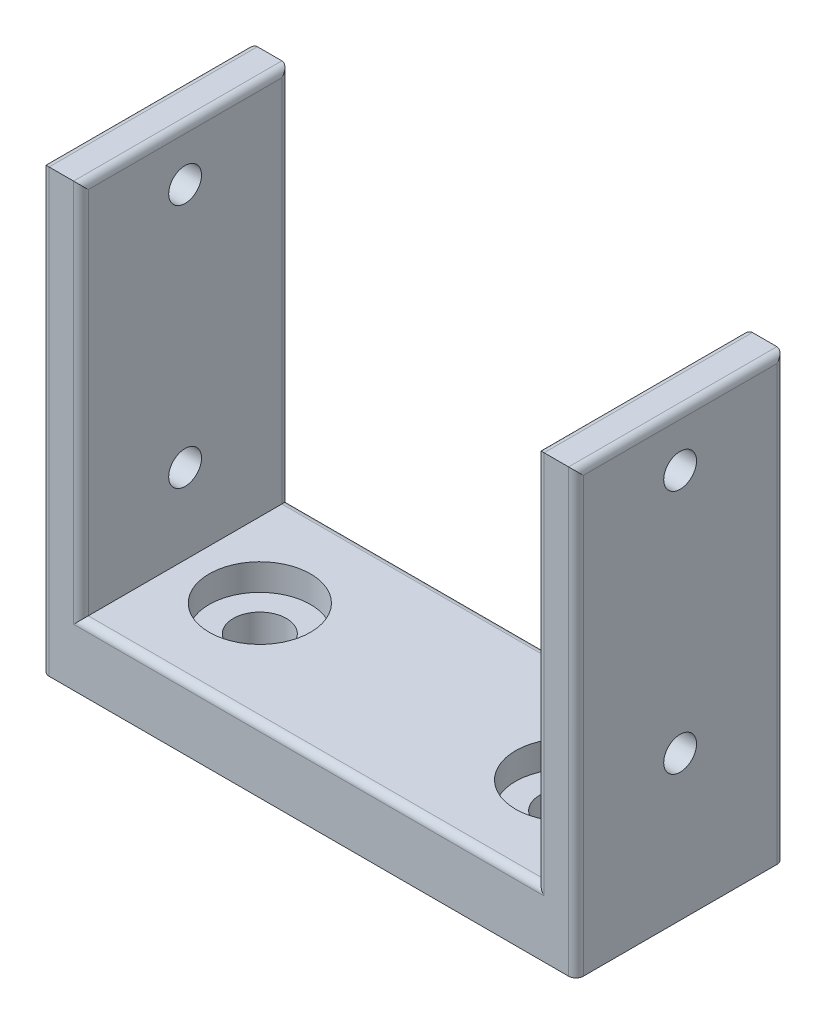
ISO-10303-21;
HEADER;
FILE_DESCRIPTION(('STEP AP214'),'2;1');
FILE_NAME('part.step','',(''),(''),'','','');
FILE_SCHEMA(('AUTOMOTIVE_DESIGN { 1 0 10303 214 1 1 1 1 }'));
ENDSEC;
DATA;
#1=APPLICATION_CONTEXT('core data for automotive mechanical design processes');
#2=APPLICATION_PROTOCOL_DEFINITION('international standard','automotive_design',2000,#1);
#3=PRODUCT_CONTEXT('',#1,'mechanical');
#4=PRODUCT('Part','Part','',(#3));
#5=PRODUCT_RELATED_PRODUCT_CATEGORY('part','',(#4));
#6=PRODUCT_DEFINITION_FORMATION('','',#4);
#7=PRODUCT_DEFINITION_CONTEXT('part definition',#1,'design');
#8=PRODUCT_DEFINITION('design','',#6,#7);
#9=PRODUCT_DEFINITION_SHAPE('','',#8);
#10=(LENGTH_UNIT() NAMED_UNIT(*) SI_UNIT(.MILLI.,.METRE.));
#11=(NAMED_UNIT(*) PLANE_ANGLE_UNIT() SI_UNIT($,.RADIAN.));
#12=(NAMED_UNIT(*) SI_UNIT($,.STERADIAN.) SOLID_ANGLE_UNIT());
#13=UNCERTAINTY_MEASURE_WITH_UNIT(LENGTH_MEASURE(1.E-05),#10,'distance_accuracy_value','');
#14=(GEOMETRIC_REPRESENTATION_CONTEXT(3) GLOBAL_UNCERTAINTY_ASSIGNED_CONTEXT((#13)) GLOBAL_UNIT_ASSIGNED_CONTEXT((#10,
#11,#12)) REPRESENTATION_CONTEXT('',''));
#15=CARTESIAN_POINT('',(0.,0.,0.));
#16=DIRECTION('',(0.,0.,1.));
#17=DIRECTION('',(1.,0.,0.));
#18=AXIS2_PLACEMENT_3D('',#15,#16,#17);
#19=CARTESIAN_POINT('',(0.,4.1599866,0.));
#20=DIRECTION('',(0.,1.,0.));
#21=DIRECTION('',(0.,0.,1.));
#22=AXIS2_PLACEMENT_3D('',#19,#20,#21);
#23=PLANE('',#22);
#24=CARTESIAN_POINT('',(11.811,4.1599866,-10.795));
#25=DIRECTION('',(0.,1.,0.));
#26=DIRECTION('',(0.,0.,1.));
#27=AXIS2_PLACEMENT_3D('',#24,#25,#26);
#28=CIRCLE('',#27,5.24999999999999);
#29=CARTESIAN_POINT('',(11.811,4.1599866,-5.54500000000001));
#30=VERTEX_POINT('',#29);
#31=EDGE_CURVE('E362',#30,#30,#28,.T.);
#32=ORIENTED_EDGE('',*,*,#31,.F.);
#33=EDGE_LOOP('',(#32));
#34=FACE_BOUND('',#33,.T.);
#35=CARTESIAN_POINT('',(43.561,4.1599866,-10.795));
#36=DIRECTION('',(0.,1.,0.));
#37=DIRECTION('',(0.,0.,1.));
#38=AXIS2_PLACEMENT_3D('',#35,#36,#37);
#39=CIRCLE('',#38,5.24999999999999);
#40=CARTESIAN_POINT('',(43.561,4.1599866,-5.54500000000001));
#41=VERTEX_POINT('',#40);
#42=EDGE_CURVE('E400',#41,#41,#39,.T.);
#43=ORIENTED_EDGE('',*,*,#42,.F.);
#44=EDGE_LOOP('',(#43));
#45=FACE_BOUND('',#44,.T.);
#46=DIRECTION('',(0.,0.,1.));
#47=VECTOR('',#46,1.);
#48=CARTESIAN_POINT('',(51.308,4.1599866,-21.59));
#49=LINE('',#48,#47);
#50=CARTESIAN_POINT('',(51.308,4.1599866,-20.828));
#51=VERTEX_POINT('',#50);
#52=CARTESIAN_POINT('',(51.308,4.1599866,-0.761999999999999));
#53=VERTEX_POINT('',#52);
#54=EDGE_CURVE('E222',#51,#53,#49,.T.);
#55=ORIENTED_EDGE('',*,*,#54,.F.);
#56=DIRECTION('',(-1.,0.,0.));
#57=VECTOR('',#56,1.);
#58=CARTESIAN_POINT('',(4.064,4.1599866,-20.828));
#59=LINE('',#58,#57);
#60=CARTESIAN_POINT('',(4.064,4.1599866,-20.828));
#61=VERTEX_POINT('',#60);
#62=EDGE_CURVE('E273',#51,#61,#59,.T.);
#63=ORIENTED_EDGE('',*,*,#62,.T.);
#64=DIRECTION('',(0.,0.,-1.));
#65=VECTOR('',#64,1.);
#66=CARTESIAN_POINT('',(4.064,4.1599866,-21.59));
#67=LINE('',#66,#65);
#68=CARTESIAN_POINT('',(4.064,4.1599866,-0.761999999999999));
#69=VERTEX_POINT('',#68);
#70=EDGE_CURVE('E226',#69,#61,#67,.T.);
#71=ORIENTED_EDGE('',*,*,#70,.F.);
#72=DIRECTION('',(1.,0.,0.));
#73=VECTOR('',#72,1.);
#74=CARTESIAN_POINT('',(51.308,4.1599866,-0.762));
#75=LINE('',#74,#73);
#76=EDGE_CURVE('E270',#69,#53,#75,.T.);
#77=ORIENTED_EDGE('',*,*,#76,.T.);
#78=EDGE_LOOP('',(#55,#63,#71,#77));
#79=FACE_BOUND('',#78,.T.);
#80=ADVANCED_FACE('F42',(#34,#45,#79),#23,.T.);
#81=CARTESIAN_POINT('',(0.,4.1599866,-21.59));
#82=DIRECTION('',(1.,0.,0.));
#83=DIRECTION('',(0.,0.,-1.));
#84=AXIS2_PLACEMENT_3D('',#81,#82,#83);
#85=PLANE('',#84);
#86=CARTESIAN_POINT('',(0.,37.8599954,-10.795));
#87=DIRECTION('',(-1.,0.,0.));
#88=DIRECTION('',(0.,0.,1.));
#89=AXIS2_PLACEMENT_3D('',#86,#87,#88);
#90=CIRCLE('',#89,1.69999999999999);
#91=CARTESIAN_POINT('',(0.,37.8599954,-9.09500000000001));
#92=VERTEX_POINT('',#91);
#93=EDGE_CURVE('E188',#92,#92,#90,.T.);
#94=ORIENTED_EDGE('',*,*,#93,.F.);
#95=EDGE_LOOP('',(#94));
#96=FACE_BOUND('',#95,.T.);
#97=CARTESIAN_POINT('',(0.,12.4599954,-10.795));
#98=DIRECTION('',(-1.,0.,0.));
#99=DIRECTION('',(0.,0.,1.));
#100=AXIS2_PLACEMENT_3D('',#97,#98,#99);
#101=CIRCLE('',#100,1.69999999999999);
#102=CARTESIAN_POINT('',(0.,12.4599954,-9.09500000000001));
#103=VERTEX_POINT('',#102);
#104=EDGE_CURVE('E208',#103,#103,#101,.T.);
#105=ORIENTED_EDGE('',*,*,#104,.F.);
#106=EDGE_LOOP('',(#105));
#107=FACE_BOUND('',#106,.T.);
#108=DIRECTION('',(0.,0.,1.));
#109=VECTOR('',#108,1.);
#110=CARTESIAN_POINT('',(0.,42.418,-21.59));
#111=LINE('',#110,#109);
#112=CARTESIAN_POINT('',(0.,42.418,-0.762));
#113=VERTEX_POINT('',#112);
#114=CARTESIAN_POINT('',(0.,42.418,-20.828));
#115=VERTEX_POINT('',#114);
#116=EDGE_CURVE('E52',#113,#115,#111,.F.);
#117=ORIENTED_EDGE('',*,*,#116,.T.);
#118=DIRECTION('',(0.,-1.,0.));
#119=VECTOR('',#118,1.);
#120=CARTESIAN_POINT('',(0.,4.1599866,-20.828));
#121=LINE('',#120,#119);
#122=CARTESIAN_POINT('',(0.,-2.54,-20.828));
#123=VERTEX_POINT('',#122);
#124=EDGE_CURVE('E11',#115,#123,#121,.T.);
#125=ORIENTED_EDGE('',*,*,#124,.T.);
#126=DIRECTION('',(0.,0.,1.));
#127=VECTOR('',#126,1.);
#128=CARTESIAN_POINT('',(0.,-2.54,-21.59));
#129=LINE('',#128,#127);
#130=CARTESIAN_POINT('',(0.,-2.54,-0.761999999999999));
#131=VERTEX_POINT('',#130);
#132=EDGE_CURVE('E380',#123,#131,#129,.T.);
#133=ORIENTED_EDGE('',*,*,#132,.T.);
#134=DIRECTION('',(0.,-1.,0.));
#135=VECTOR('',#134,1.);
#136=CARTESIAN_POINT('',(0.,4.1599866,-0.761999999999999));
#137=LINE('',#136,#135);
#138=EDGE_CURVE('E63',#131,#113,#137,.F.);
#139=ORIENTED_EDGE('',*,*,#138,.T.);
#140=EDGE_LOOP('',(#117,#125,#133,#139));
#141=FACE_BOUND('',#140,.T.);
#142=ADVANCED_FACE('F379',(#96,#107,#141),#85,.F.);
#143=CARTESIAN_POINT('',(0.,4.1599866,0.));
#144=DIRECTION('',(0.,0.,-1.));
#145=DIRECTION('',(-1.,0.,0.));
#146=AXIS2_PLACEMENT_3D('',#143,#144,#145);
#147=PLANE('',#146);
#148=DIRECTION('',(1.,0.,0.));
#149=VECTOR('',#148,1.);
#150=CARTESIAN_POINT('',(0.,-2.54,0.));
#151=LINE('',#150,#149);
#152=CARTESIAN_POINT('',(0.762,-2.54,0.));
#153=VERTEX_POINT('',#152);
#154=CARTESIAN_POINT('',(54.61,-2.54,0.));
#155=VERTEX_POINT('',#154);
#156=EDGE_CURVE('E196',#153,#155,#151,.T.);
#157=ORIENTED_EDGE('',*,*,#156,.T.);
#158=DIRECTION('',(0.,-1.,0.));
#159=VECTOR('',#158,1.);
#160=CARTESIAN_POINT('',(54.61,4.1599866,0.));
#161=LINE('',#160,#159);
#162=CARTESIAN_POINT('',(54.61,43.18,0.));
#163=VERTEX_POINT('',#162);
#164=EDGE_CURVE('E317',#155,#163,#161,.F.);
#165=ORIENTED_EDGE('',*,*,#164,.T.);
#166=DIRECTION('',(1.,0.,0.));
#167=VECTOR('',#166,1.);
#168=CARTESIAN_POINT('',(55.372,43.18,0.));
#169=LINE('',#168,#167);
#170=CARTESIAN_POINT('',(52.07,43.18,0.));
#171=VERTEX_POINT('',#170);
#172=EDGE_CURVE('E221',#171,#163,#169,.T.);
#173=ORIENTED_EDGE('',*,*,#172,.F.);
#174=DIRECTION('',(0.,-1.,0.));
#175=VECTOR('',#174,1.);
#176=CARTESIAN_POINT('',(52.07,4.1599866,0.));
#177=LINE('',#176,#175);
#178=CARTESIAN_POINT('',(52.07,3.3979866,0.));
#179=VERTEX_POINT('',#178);
#180=EDGE_CURVE('E311',#171,#179,#177,.T.);
#181=ORIENTED_EDGE('',*,*,#180,.T.);
#182=DIRECTION('',(1.,0.,0.));
#183=VECTOR('',#182,1.);
#184=CARTESIAN_POINT('',(4.064,3.3979866,0.));
#185=LINE('',#184,#183);
#186=CARTESIAN_POINT('',(3.302,3.3979866,0.));
#187=VERTEX_POINT('',#186);
#188=EDGE_CURVE('E308',#179,#187,#185,.F.);
#189=ORIENTED_EDGE('',*,*,#188,.T.);
#190=DIRECTION('',(0.,-1.,0.));
#191=VECTOR('',#190,1.);
#192=CARTESIAN_POINT('',(3.302,4.1599866,0.));
#193=LINE('',#192,#191);
#194=CARTESIAN_POINT('',(3.302,43.18,0.));
#195=VERTEX_POINT('',#194);
#196=EDGE_CURVE('E305',#187,#195,#193,.F.);
#197=ORIENTED_EDGE('',*,*,#196,.T.);
#198=DIRECTION('',(1.,0.,0.));
#199=VECTOR('',#198,1.);
#200=CARTESIAN_POINT('',(0.,43.18,0.));
#201=LINE('',#200,#199);
#202=CARTESIAN_POINT('',(0.762,43.18,0.));
#203=VERTEX_POINT('',#202);
#204=EDGE_CURVE('E232',#203,#195,#201,.T.);
#205=ORIENTED_EDGE('',*,*,#204,.F.);
#206=DIRECTION('',(0.,-1.,0.));
#207=VECTOR('',#206,1.);
#208=CARTESIAN_POINT('',(0.762,4.1599866,0.));
#209=LINE('',#208,#207);
#210=EDGE_CURVE('E314',#203,#153,#209,.T.);
#211=ORIENTED_EDGE('',*,*,#210,.T.);
#212=EDGE_LOOP('',(#157,#165,#173,#181,#189,#197,#205,#211));
#213=FACE_BOUND('',#212,.T.);
#214=ADVANCED_FACE('F463',(#213),#147,.F.);
#215=CARTESIAN_POINT('',(55.372,4.1599866,-21.59));
#216=DIRECTION('',(-1.,0.,0.));
#217=DIRECTION('',(0.,0.,1.));
#218=AXIS2_PLACEMENT_3D('',#215,#216,#217);
#219=PLANE('',#218);
#220=CARTESIAN_POINT('',(55.372,37.8599954,-10.795));
#221=DIRECTION('',(-1.,0.,0.));
#222=DIRECTION('',(0.,0.,1.));
#223=AXIS2_PLACEMENT_3D('',#220,#221,#222);
#224=CIRCLE('',#223,1.69999999999999);
#225=CARTESIAN_POINT('',(55.372,37.8599954,-9.09500000000001));
#226=VERTEX_POINT('',#225);
#227=EDGE_CURVE('E194',#226,#226,#224,.T.);
#228=ORIENTED_EDGE('',*,*,#227,.T.);
#229=EDGE_LOOP('',(#228));
#230=FACE_BOUND('',#229,.T.);
#231=CARTESIAN_POINT('',(55.372,12.4599954,-10.795));
#232=DIRECTION('',(-1.,0.,0.));
#233=DIRECTION('',(0.,0.,1.));
#234=AXIS2_PLACEMENT_3D('',#231,#232,#233);
#235=CIRCLE('',#234,1.69999999999999);
#236=CARTESIAN_POINT('',(55.372,12.4599954,-9.09500000000001));
#237=VERTEX_POINT('',#236);
#238=EDGE_CURVE('E212',#237,#237,#235,.T.);
#239=ORIENTED_EDGE('',*,*,#238,.T.);
#240=EDGE_LOOP('',(#239));
#241=FACE_BOUND('',#240,.T.);
#242=DIRECTION('',(0.,0.,-1.));
#243=VECTOR('',#242,1.);
#244=CARTESIAN_POINT('',(55.372,-2.54,-21.59));
#245=LINE('',#244,#243);
#246=CARTESIAN_POINT('',(55.372,-2.54,-0.761999999999999));
#247=VERTEX_POINT('',#246);
#248=CARTESIAN_POINT('',(55.372,-2.54,-20.828));
#249=VERTEX_POINT('',#248);
#250=EDGE_CURVE('E189',#247,#249,#245,.T.);
#251=ORIENTED_EDGE('',*,*,#250,.T.);
#252=DIRECTION('',(0.,-1.,0.));
#253=VECTOR('',#252,1.);
#254=CARTESIAN_POINT('',(55.372,4.1599866,-20.828));
#255=LINE('',#254,#253);
#256=CARTESIAN_POINT('',(55.372,42.418,-20.828));
#257=VERTEX_POINT('',#256);
#258=EDGE_CURVE('E160',#249,#257,#255,.F.);
#259=ORIENTED_EDGE('',*,*,#258,.T.);
#260=DIRECTION('',(0.,0.,-1.));
#261=VECTOR('',#260,1.);
#262=CARTESIAN_POINT('',(55.372,42.418,-21.59));
#263=LINE('',#262,#261);
#264=CARTESIAN_POINT('',(55.372,42.418,-0.761999999999999));
#265=VERTEX_POINT('',#264);
#266=EDGE_CURVE('E294',#257,#265,#263,.F.);
#267=ORIENTED_EDGE('',*,*,#266,.T.);
#268=DIRECTION('',(0.,-1.,0.));
#269=VECTOR('',#268,1.);
#270=CARTESIAN_POINT('',(55.372,4.1599866,-0.761999999999999));
#271=LINE('',#270,#269);
#272=EDGE_CURVE('E166',#265,#247,#271,.T.);
#273=ORIENTED_EDGE('',*,*,#272,.T.);
#274=EDGE_LOOP('',(#251,#259,#267,#273));
#275=FACE_BOUND('',#274,.T.);
#276=ADVANCED_FACE('F541',(#230,#241,#275),#219,.F.);
#277=CARTESIAN_POINT('',(0.,4.1599866,-21.59));
#278=DIRECTION('',(0.,0.,1.));
#279=DIRECTION('',(1.,0.,0.));
#280=AXIS2_PLACEMENT_3D('',#277,#278,#279);
#281=PLANE('',#280);
#282=DIRECTION('',(-1.,0.,0.));
#283=VECTOR('',#282,1.);
#284=CARTESIAN_POINT('',(0.,43.18,-21.59));
#285=LINE('',#284,#283);
#286=CARTESIAN_POINT('',(3.302,43.18,-21.59));
#287=VERTEX_POINT('',#286);
#288=CARTESIAN_POINT('',(0.762,43.18,-21.59));
#289=VERTEX_POINT('',#288);
#290=EDGE_CURVE('E236',#287,#289,#285,.T.);
#291=ORIENTED_EDGE('',*,*,#290,.F.);
#292=DIRECTION('',(0.,-1.,0.));
#293=VECTOR('',#292,1.);
#294=CARTESIAN_POINT('',(3.302,4.1599866,-21.59));
#295=LINE('',#294,#293);
#296=CARTESIAN_POINT('',(3.302,3.3979866,-21.59));
#297=VERTEX_POINT('',#296);
#298=EDGE_CURVE('E256',#287,#297,#295,.T.);
#299=ORIENTED_EDGE('',*,*,#298,.T.);
#300=DIRECTION('',(-1.,0.,0.));
#301=VECTOR('',#300,1.);
#302=CARTESIAN_POINT('',(51.308,3.3979866,-21.59));
#303=LINE('',#302,#301);
#304=CARTESIAN_POINT('',(52.07,3.3979866,-21.59));
#305=VERTEX_POINT('',#304);
#306=EDGE_CURVE('E253',#297,#305,#303,.F.);
#307=ORIENTED_EDGE('',*,*,#306,.T.);
#308=DIRECTION('',(0.,-1.,0.));
#309=VECTOR('',#308,1.);
#310=CARTESIAN_POINT('',(52.07,4.1599866,-21.59));
#311=LINE('',#310,#309);
#312=CARTESIAN_POINT('',(52.07,43.18,-21.59));
#313=VERTEX_POINT('',#312);
#314=EDGE_CURVE('E180',#305,#313,#311,.F.);
#315=ORIENTED_EDGE('',*,*,#314,.T.);
#316=DIRECTION('',(-1.,0.,0.));
#317=VECTOR('',#316,1.);
#318=CARTESIAN_POINT('',(55.372,43.18,-21.59));
#319=LINE('',#318,#317);
#320=CARTESIAN_POINT('',(54.61,43.18,-21.59));
#321=VERTEX_POINT('',#320);
#322=EDGE_CURVE('E177',#321,#313,#319,.T.);
#323=ORIENTED_EDGE('',*,*,#322,.F.);
#324=DIRECTION('',(0.,-1.,0.));
#325=VECTOR('',#324,1.);
#326=CARTESIAN_POINT('',(54.61,4.1599866,-21.59));
#327=LINE('',#326,#325);
#328=CARTESIAN_POINT('',(54.61,-2.54,-21.59));
#329=VERTEX_POINT('',#328);
#330=EDGE_CURVE('E159',#321,#329,#327,.T.);
#331=ORIENTED_EDGE('',*,*,#330,.T.);
#332=DIRECTION('',(-1.,0.,0.));
#333=VECTOR('',#332,1.);
#334=CARTESIAN_POINT('',(0.,-2.54,-21.59));
#335=LINE('',#334,#333);
#336=CARTESIAN_POINT('',(0.762,-2.54,-21.59));
#337=VERTEX_POINT('',#336);
#338=EDGE_CURVE('E174',#329,#337,#335,.T.);
#339=ORIENTED_EDGE('',*,*,#338,.T.);
#340=DIRECTION('',(0.,-1.,0.));
#341=VECTOR('',#340,1.);
#342=CARTESIAN_POINT('',(0.762,4.1599866,-21.59));
#343=LINE('',#342,#341);
#344=EDGE_CURVE('E181',#337,#289,#343,.F.);
#345=ORIENTED_EDGE('',*,*,#344,.T.);
#346=EDGE_LOOP('',(#291,#299,#307,#315,#323,#331,#339,#345));
#347=FACE_BOUND('',#346,.T.);
#348=ADVANCED_FACE('F173',(#347),#281,.F.);
#349=CARTESIAN_POINT('',(4.064,43.18,-21.59));
#350=DIRECTION('',(-1.,0.,0.));
#351=DIRECTION('',(0.,0.,1.));
#352=AXIS2_PLACEMENT_3D('',#349,#350,#351);
#353=PLANE('',#352);
#354=CARTESIAN_POINT('',(4.064,37.8599954,-10.795));
#355=DIRECTION('',(-1.,0.,0.));
#356=DIRECTION('',(0.,0.,1.));
#357=AXIS2_PLACEMENT_3D('',#354,#355,#356);
#358=CIRCLE('',#357,1.69999999999999);
#359=CARTESIAN_POINT('',(4.064,37.8599954,-9.09500000000001));
#360=VERTEX_POINT('',#359);
#361=EDGE_CURVE('E204',#360,#360,#358,.T.);
#362=ORIENTED_EDGE('',*,*,#361,.T.);
#363=EDGE_LOOP('',(#362));
#364=FACE_BOUND('',#363,.T.);
#365=CARTESIAN_POINT('',(4.064,12.4599954,-10.795));
#366=DIRECTION('',(-1.,0.,0.));
#367=DIRECTION('',(0.,0.,1.));
#368=AXIS2_PLACEMENT_3D('',#365,#366,#367);
#369=CIRCLE('',#368,1.69999999999999);
#370=CARTESIAN_POINT('',(4.064,12.4599954,-9.09500000000001));
#371=VERTEX_POINT('',#370);
#372=EDGE_CURVE('E217',#371,#371,#369,.T.);
#373=ORIENTED_EDGE('',*,*,#372,.T.);
#374=EDGE_LOOP('',(#373));
#375=FACE_BOUND('',#374,.T.);
#376=ORIENTED_EDGE('',*,*,#70,.T.);
#377=DIRECTION('',(0.,-1.,0.));
#378=VECTOR('',#377,1.);
#379=CARTESIAN_POINT('',(4.064,43.18,-20.828));
#380=LINE('',#379,#378);
#381=CARTESIAN_POINT('',(4.064,42.418,-20.828));
#382=VERTEX_POINT('',#381);
#383=EDGE_CURVE('E266',#61,#382,#380,.F.);
#384=ORIENTED_EDGE('',*,*,#383,.T.);
#385=DIRECTION('',(0.,0.,-1.));
#386=VECTOR('',#385,1.);
#387=CARTESIAN_POINT('',(4.064,42.418,0.));
#388=LINE('',#387,#386);
#389=CARTESIAN_POINT('',(4.064,42.418,-0.761999999999999));
#390=VERTEX_POINT('',#389);
#391=EDGE_CURVE('E263',#382,#390,#388,.F.);
#392=ORIENTED_EDGE('',*,*,#391,.T.);
#393=DIRECTION('',(0.,-1.,0.));
#394=VECTOR('',#393,1.);
#395=CARTESIAN_POINT('',(4.064,43.18,-0.761999999999999));
#396=LINE('',#395,#394);
#397=EDGE_CURVE('E260',#390,#69,#396,.T.);
#398=ORIENTED_EDGE('',*,*,#397,.T.);
#399=EDGE_LOOP('',(#376,#384,#392,#398));
#400=FACE_BOUND('',#399,.T.);
#401=ADVANCED_FACE('F449',(#364,#375,#400),#353,.F.);
#402=CARTESIAN_POINT('',(0.,43.18,0.));
#403=DIRECTION('',(0.,1.,0.));
#404=DIRECTION('',(0.,0.,1.));
#405=AXIS2_PLACEMENT_3D('',#402,#403,#404);
#406=PLANE('',#405);
#407=ORIENTED_EDGE('',*,*,#204,.T.);
#408=DIRECTION('',(0.,0.,-1.));
#409=VECTOR('',#408,1.);
#410=CARTESIAN_POINT('',(3.302,43.18,-21.59));
#411=LINE('',#410,#409);
#412=EDGE_CURVE('E324',#195,#287,#411,.T.);
#413=ORIENTED_EDGE('',*,*,#412,.T.);
#414=ORIENTED_EDGE('',*,*,#290,.T.);
#415=DIRECTION('',(0.,0.,1.));
#416=VECTOR('',#415,1.);
#417=CARTESIAN_POINT('',(0.762,43.18,0.));
#418=LINE('',#417,#416);
#419=EDGE_CURVE('E320',#289,#203,#418,.T.);
#420=ORIENTED_EDGE('',*,*,#419,.T.);
#421=EDGE_LOOP('',(#407,#413,#414,#420));
#422=FACE_BOUND('',#421,.T.);
#423=ADVANCED_FACE('F465',(#422),#406,.T.);
#424=CARTESIAN_POINT('',(51.308,43.18,-21.59));
#425=DIRECTION('',(1.,0.,0.));
#426=DIRECTION('',(0.,0.,-1.));
#427=AXIS2_PLACEMENT_3D('',#424,#425,#426);
#428=PLANE('',#427);
#429=CARTESIAN_POINT('',(51.308,37.8599954,-10.795));
#430=DIRECTION('',(1.,0.,0.));
#431=DIRECTION('',(0.,0.,-1.));
#432=AXIS2_PLACEMENT_3D('',#429,#430,#431);
#433=CIRCLE('',#432,1.69999999999999);
#434=CARTESIAN_POINT('',(51.308,37.8599954,-12.495));
#435=VERTEX_POINT('',#434);
#436=EDGE_CURVE('E203',#435,#435,#433,.T.);
#437=ORIENTED_EDGE('',*,*,#436,.T.);
#438=EDGE_LOOP('',(#437));
#439=FACE_BOUND('',#438,.T.);
#440=CARTESIAN_POINT('',(51.308,12.4599954,-10.795));
#441=DIRECTION('',(1.,0.,0.));
#442=DIRECTION('',(0.,0.,-1.));
#443=AXIS2_PLACEMENT_3D('',#440,#441,#442);
#444=CIRCLE('',#443,1.69999999999999);
#445=CARTESIAN_POINT('',(51.308,12.4599954,-12.495));
#446=VERTEX_POINT('',#445);
#447=EDGE_CURVE('E216',#446,#446,#444,.T.);
#448=ORIENTED_EDGE('',*,*,#447,.T.);
#449=EDGE_LOOP('',(#448));
#450=FACE_BOUND('',#449,.T.);
#451=DIRECTION('',(0.,0.,1.));
#452=VECTOR('',#451,1.);
#453=CARTESIAN_POINT('',(51.308,42.418,-21.59));
#454=LINE('',#453,#452);
#455=CARTESIAN_POINT('',(51.308,42.418,-0.762));
#456=VERTEX_POINT('',#455);
#457=CARTESIAN_POINT('',(51.308,42.418,-20.828));
#458=VERTEX_POINT('',#457);
#459=EDGE_CURVE('E279',#456,#458,#454,.F.);
#460=ORIENTED_EDGE('',*,*,#459,.T.);
#461=DIRECTION('',(0.,-1.,0.));
#462=VECTOR('',#461,1.);
#463=CARTESIAN_POINT('',(51.308,43.18,-20.828));
#464=LINE('',#463,#462);
#465=EDGE_CURVE('E282',#458,#51,#464,.T.);
#466=ORIENTED_EDGE('',*,*,#465,.T.);
#467=ORIENTED_EDGE('',*,*,#54,.T.);
#468=DIRECTION('',(0.,-1.,0.));
#469=VECTOR('',#468,1.);
#470=CARTESIAN_POINT('',(51.308,43.18,-0.761999999999999));
#471=LINE('',#470,#469);
#472=EDGE_CURVE('E276',#53,#456,#471,.F.);
#473=ORIENTED_EDGE('',*,*,#472,.T.);
#474=EDGE_LOOP('',(#460,#466,#467,#473));
#475=FACE_BOUND('',#474,.T.);
#476=ADVANCED_FACE('F520',(#439,#450,#475),#428,.F.);
#477=CARTESIAN_POINT('',(0.,43.18,0.));
#478=DIRECTION('',(0.,-1.,0.));
#479=DIRECTION('',(0.,0.,-1.));
#480=AXIS2_PLACEMENT_3D('',#477,#478,#479);
#481=PLANE('',#480);
#482=ORIENTED_EDGE('',*,*,#322,.T.);
#483=DIRECTION('',(0.,0.,1.));
#484=VECTOR('',#483,1.);
#485=CARTESIAN_POINT('',(52.07,43.18,0.));
#486=LINE('',#485,#484);
#487=EDGE_CURVE('E302',#313,#171,#486,.T.);
#488=ORIENTED_EDGE('',*,*,#487,.T.);
#489=ORIENTED_EDGE('',*,*,#172,.T.);
#490=DIRECTION('',(0.,0.,-1.));
#491=VECTOR('',#490,1.);
#492=CARTESIAN_POINT('',(54.61,43.18,0.));
#493=LINE('',#492,#491);
#494=EDGE_CURVE('E299',#163,#321,#493,.T.);
#495=ORIENTED_EDGE('',*,*,#494,.T.);
#496=EDGE_LOOP('',(#482,#488,#489,#495));
#497=FACE_BOUND('',#496,.T.);
#498=ADVANCED_FACE('F515',(#497),#481,.F.);
#499=CARTESIAN_POINT('',(0.,12.4599954,-10.795));
#500=DIRECTION('',(-1.,0.,0.));
#501=DIRECTION('',(0.,0.,1.));
#502=AXIS2_PLACEMENT_3D('',#499,#500,#501);
#503=CYLINDRICAL_SURFACE('',#502,1.69999999999999);
#504=ORIENTED_EDGE('',*,*,#238,.F.);
#505=EDGE_LOOP('',(#504));
#506=FACE_BOUND('',#505,.T.);
#507=ORIENTED_EDGE('',*,*,#447,.F.);
#508=EDGE_LOOP('',(#507));
#509=FACE_BOUND('',#508,.T.);
#510=ADVANCED_FACE('F528',(#506,#509),#503,.F.);
#511=ORIENTED_EDGE('',*,*,#104,.T.);
#512=EDGE_LOOP('',(#511));
#513=FACE_BOUND('',#512,.T.);
#514=ORIENTED_EDGE('',*,*,#372,.F.);
#515=EDGE_LOOP('',(#514));
#516=FACE_BOUND('',#515,.T.);
#517=ADVANCED_FACE('F533',(#513,#516),#503,.F.);
#518=CARTESIAN_POINT('',(0.,37.8599954,-10.795));
#519=DIRECTION('',(-1.,0.,0.));
#520=DIRECTION('',(0.,0.,1.));
#521=AXIS2_PLACEMENT_3D('',#518,#519,#520);
#522=CYLINDRICAL_SURFACE('',#521,1.69999999999999);
#523=ORIENTED_EDGE('',*,*,#227,.F.);
#524=EDGE_LOOP('',(#523));
#525=FACE_BOUND('',#524,.T.);
#526=ORIENTED_EDGE('',*,*,#436,.F.);
#527=EDGE_LOOP('',(#526));
#528=FACE_BOUND('',#527,.T.);
#529=ADVANCED_FACE('F721',(#525,#528),#522,.F.);
#530=ORIENTED_EDGE('',*,*,#93,.T.);
#531=EDGE_LOOP('',(#530));
#532=FACE_BOUND('',#531,.T.);
#533=ORIENTED_EDGE('',*,*,#361,.F.);
#534=EDGE_LOOP('',(#533));
#535=FACE_BOUND('',#534,.T.);
#536=ADVANCED_FACE('F710',(#532,#535),#522,.F.);
#537=CARTESIAN_POINT('',(0.,-2.54,0.));
#538=DIRECTION('',(0.,1.,0.));
#539=DIRECTION('',(0.,0.,1.));
#540=AXIS2_PLACEMENT_3D('',#537,#538,#539);
#541=PLANE('',#540);
#542=CARTESIAN_POINT('',(11.811,-2.54,-10.795));
#543=DIRECTION('',(0.,1.,0.));
#544=DIRECTION('',(0.,0.,1.));
#545=AXIS2_PLACEMENT_3D('',#542,#543,#544);
#546=CIRCLE('',#545,2.75);
#547=CARTESIAN_POINT('',(11.811,-2.54,-8.045));
#548=VERTEX_POINT('',#547);
#549=EDGE_CURVE('E404',#548,#548,#546,.T.);
#550=ORIENTED_EDGE('',*,*,#549,.T.);
#551=EDGE_LOOP('',(#550));
#552=FACE_BOUND('',#551,.T.);
#553=CARTESIAN_POINT('',(43.561,-2.54,-10.795));
#554=DIRECTION('',(0.,1.,0.));
#555=DIRECTION('',(0.,0.,1.));
#556=AXIS2_PLACEMENT_3D('',#553,#554,#555);
#557=CIRCLE('',#556,2.75);
#558=CARTESIAN_POINT('',(43.561,-2.54,-8.04500000000001));
#559=VERTEX_POINT('',#558);
#560=EDGE_CURVE('E384',#559,#559,#557,.T.);
#561=ORIENTED_EDGE('',*,*,#560,.T.);
#562=EDGE_LOOP('',(#561));
#563=FACE_BOUND('',#562,.T.);
#564=ORIENTED_EDGE('',*,*,#338,.F.);
#565=CARTESIAN_POINT('',(54.61,-2.54,-20.828));
#566=DIRECTION('',(0.,1.,0.));
#567=DIRECTION('',(0.,0.,1.));
#568=AXIS2_PLACEMENT_3D('',#565,#566,#567);
#569=CIRCLE('',#568,0.762);
#570=EDGE_CURVE('E155',#329,#249,#569,.F.);
#571=ORIENTED_EDGE('',*,*,#570,.T.);
#572=ORIENTED_EDGE('',*,*,#250,.F.);
#573=CARTESIAN_POINT('',(54.61,-2.54,-0.761999999999999));
#574=DIRECTION('',(0.,1.,0.));
#575=DIRECTION('',(0.,0.,1.));
#576=AXIS2_PLACEMENT_3D('',#573,#574,#575);
#577=CIRCLE('',#576,0.762);
#578=EDGE_CURVE('E167',#247,#155,#577,.F.);
#579=ORIENTED_EDGE('',*,*,#578,.T.);
#580=ORIENTED_EDGE('',*,*,#156,.F.);
#581=CARTESIAN_POINT('',(0.762,-2.54,-0.762));
#582=DIRECTION('',(0.,1.,0.));
#583=DIRECTION('',(0.,0.,1.));
#584=AXIS2_PLACEMENT_3D('',#581,#582,#583);
#585=CIRCLE('',#584,0.762);
#586=EDGE_CURVE('E285',#153,#131,#585,.F.);
#587=ORIENTED_EDGE('',*,*,#586,.T.);
#588=ORIENTED_EDGE('',*,*,#132,.F.);
#589=CARTESIAN_POINT('',(0.762,-2.54,-20.828));
#590=DIRECTION('',(0.,1.,0.));
#591=DIRECTION('',(0.,0.,1.));
#592=AXIS2_PLACEMENT_3D('',#589,#590,#591);
#593=CIRCLE('',#592,0.762);
#594=EDGE_CURVE('E186',#123,#337,#593,.F.);
#595=ORIENTED_EDGE('',*,*,#594,.T.);
#596=EDGE_LOOP('',(#564,#571,#572,#579,#580,#587,#588,#595));
#597=FACE_BOUND('',#596,.T.);
#598=ADVANCED_FACE('F183',(#552,#563,#597),#541,.F.);
#599=CARTESIAN_POINT('',(43.561,4.1599866,-10.795));
#600=DIRECTION('',(0.,1.,0.));
#601=DIRECTION('',(0.,0.,1.));
#602=AXIS2_PLACEMENT_3D('',#599,#600,#601);
#603=CYLINDRICAL_SURFACE('',#602,2.75);
#604=ORIENTED_EDGE('',*,*,#560,.F.);
#605=EDGE_LOOP('',(#604));
#606=FACE_BOUND('',#605,.T.);
#607=CARTESIAN_POINT('',(43.561,1.4099866,-10.795));
#608=DIRECTION('',(0.,1.,0.));
#609=DIRECTION('',(0.,0.,1.));
#610=AXIS2_PLACEMENT_3D('',#607,#608,#609);
#611=CIRCLE('',#610,2.75);
#612=CARTESIAN_POINT('',(43.561,1.4099866,-8.045));
#613=VERTEX_POINT('',#612);
#614=EDGE_CURVE('E390',#613,#613,#611,.T.);
#615=ORIENTED_EDGE('',*,*,#614,.T.);
#616=EDGE_LOOP('',(#615));
#617=FACE_BOUND('',#616,.T.);
#618=ADVANCED_FACE('F691',(#606,#617),#603,.F.);
#619=CARTESIAN_POINT('',(46.311,1.4099866,-10.795));
#620=DIRECTION('',(0.,-1.,0.));
#621=DIRECTION('',(0.,0.,-1.));
#622=AXIS2_PLACEMENT_3D('',#619,#620,#621);
#623=PLANE('',#622);
#624=ORIENTED_EDGE('',*,*,#614,.F.);
#625=EDGE_LOOP('',(#624));
#626=FACE_BOUND('',#625,.T.);
#627=CARTESIAN_POINT('',(43.561,1.4099866,-10.795));
#628=DIRECTION('',(0.,1.,0.));
#629=DIRECTION('',(0.,0.,1.));
#630=AXIS2_PLACEMENT_3D('',#627,#628,#629);
#631=CIRCLE('',#630,5.25);
#632=CARTESIAN_POINT('',(43.561,1.4099866,-5.545));
#633=VERTEX_POINT('',#632);
#634=EDGE_CURVE('E396',#633,#633,#631,.T.);
#635=ORIENTED_EDGE('',*,*,#634,.T.);
#636=EDGE_LOOP('',(#635));
#637=FACE_BOUND('',#636,.T.);
#638=ADVANCED_FACE('F681',(#626,#637),#623,.F.);
#639=CARTESIAN_POINT('',(43.561,4.1599866,-10.795));
#640=DIRECTION('',(0.,1.,0.));
#641=DIRECTION('',(0.,0.,1.));
#642=AXIS2_PLACEMENT_3D('',#639,#640,#641);
#643=CYLINDRICAL_SURFACE('',#642,5.24999999999999);
#644=ORIENTED_EDGE('',*,*,#634,.F.);
#645=EDGE_LOOP('',(#644));
#646=FACE_BOUND('',#645,.T.);
#647=ORIENTED_EDGE('',*,*,#42,.T.);
#648=EDGE_LOOP('',(#647));
#649=FACE_BOUND('',#648,.T.);
#650=ADVANCED_FACE('F671',(#646,#649),#643,.F.);
#651=CARTESIAN_POINT('',(11.811,4.1599866,-10.795));
#652=DIRECTION('',(0.,1.,0.));
#653=DIRECTION('',(0.,0.,1.));
#654=AXIS2_PLACEMENT_3D('',#651,#652,#653);
#655=CYLINDRICAL_SURFACE('',#654,2.75);
#656=ORIENTED_EDGE('',*,*,#549,.F.);
#657=EDGE_LOOP('',(#656));
#658=FACE_BOUND('',#657,.T.);
#659=CARTESIAN_POINT('',(11.811,1.4099866,-10.795));
#660=DIRECTION('',(0.,1.,0.));
#661=DIRECTION('',(0.,0.,1.));
#662=AXIS2_PLACEMENT_3D('',#659,#660,#661);
#663=CIRCLE('',#662,2.75);
#664=CARTESIAN_POINT('',(11.811,1.4099866,-8.045));
#665=VERTEX_POINT('',#664);
#666=EDGE_CURVE('E408',#665,#665,#663,.T.);
#667=ORIENTED_EDGE('',*,*,#666,.T.);
#668=EDGE_LOOP('',(#667));
#669=FACE_BOUND('',#668,.T.);
#670=ADVANCED_FACE('F661',(#658,#669),#655,.F.);
#671=CARTESIAN_POINT('',(14.561,1.4099866,-10.795));
#672=DIRECTION('',(0.,-1.,0.));
#673=DIRECTION('',(0.,0.,-1.));
#674=AXIS2_PLACEMENT_3D('',#671,#672,#673);
#675=PLANE('',#674);
#676=ORIENTED_EDGE('',*,*,#666,.F.);
#677=EDGE_LOOP('',(#676));
#678=FACE_BOUND('',#677,.T.);
#679=CARTESIAN_POINT('',(11.811,1.4099866,-10.795));
#680=DIRECTION('',(0.,1.,0.));
#681=DIRECTION('',(0.,0.,1.));
#682=AXIS2_PLACEMENT_3D('',#679,#680,#681);
#683=CIRCLE('',#682,5.25);
#684=CARTESIAN_POINT('',(11.811,1.4099866,-5.545));
#685=VERTEX_POINT('',#684);
#686=EDGE_CURVE('E412',#685,#685,#683,.T.);
#687=ORIENTED_EDGE('',*,*,#686,.T.);
#688=EDGE_LOOP('',(#687));
#689=FACE_BOUND('',#688,.T.);
#690=ADVANCED_FACE('F651',(#678,#689),#675,.F.);
#691=CARTESIAN_POINT('',(11.811,4.1599866,-10.795));
#692=DIRECTION('',(0.,1.,0.));
#693=DIRECTION('',(0.,0.,1.));
#694=AXIS2_PLACEMENT_3D('',#691,#692,#693);
#695=CYLINDRICAL_SURFACE('',#694,5.25);
#696=ORIENTED_EDGE('',*,*,#686,.F.);
#697=EDGE_LOOP('',(#696));
#698=FACE_BOUND('',#697,.T.);
#699=ORIENTED_EDGE('',*,*,#31,.T.);
#700=EDGE_LOOP('',(#699));
#701=FACE_BOUND('',#700,.T.);
#702=ADVANCED_FACE('F420',(#698,#701),#695,.F.);
#703=CARTESIAN_POINT('',(52.07,4.1599866,-0.762));
#704=DIRECTION('',(0.,-1.,0.));
#705=DIRECTION('',(0.,0.,-1.));
#706=AXIS2_PLACEMENT_3D('',#703,#704,#705);
#707=CYLINDRICAL_SURFACE('',#706,0.762);
#708=CARTESIAN_POINT('',(52.07,42.418,-0.762));
#709=DIRECTION('',(0.,-0.707106781186547,0.707106781186547));
#710=DIRECTION('',(0.,-0.707106781186547,-0.707106781186547));
#711=AXIS2_PLACEMENT_3D('',#708,#709,#710);
#712=ELLIPSE('',#711,1.0776307345283,0.762);
#713=EDGE_CURVE('E354',#456,#171,#712,.F.);
#714=ORIENTED_EDGE('',*,*,#713,.F.);
#715=ORIENTED_EDGE('',*,*,#472,.F.);
#716=CARTESIAN_POINT('',(52.07,3.3979866,-0.762));
#717=DIRECTION('',(-0.707106781186547,-0.707106781186547,0.));
#718=DIRECTION('',(-0.707106781186547,0.707106781186547,0.));
#719=AXIS2_PLACEMENT_3D('',#716,#717,#718);
#720=ELLIPSE('',#719,1.0776307345283,0.762);
#721=EDGE_CURVE('E358',#179,#53,#720,.T.);
#722=ORIENTED_EDGE('',*,*,#721,.F.);
#723=ORIENTED_EDGE('',*,*,#180,.F.);
#724=EDGE_LOOP('',(#714,#715,#722,#723));
#725=FACE_BOUND('',#724,.T.);
#726=ADVANCED_FACE('F486',(#725),#707,.T.);
#727=CARTESIAN_POINT('',(0.,3.3979866,-0.762));
#728=DIRECTION('',(-1.,0.,0.));
#729=DIRECTION('',(0.,0.,1.));
#730=AXIS2_PLACEMENT_3D('',#727,#728,#729);
#731=CYLINDRICAL_SURFACE('',#730,0.762);
#732=ORIENTED_EDGE('',*,*,#721,.T.);
#733=ORIENTED_EDGE('',*,*,#76,.F.);
#734=CARTESIAN_POINT('',(3.302,3.3979866,-0.761999999999999));
#735=DIRECTION('',(-0.707106781186547,0.707106781186547,0.));
#736=DIRECTION('',(-0.707106781186547,-0.707106781186547,0.));
#737=AXIS2_PLACEMENT_3D('',#734,#735,#736);
#738=ELLIPSE('',#737,1.0776307345283,0.762);
#739=EDGE_CURVE('E350',#187,#69,#738,.T.);
#740=ORIENTED_EDGE('',*,*,#739,.F.);
#741=ORIENTED_EDGE('',*,*,#188,.F.);
#742=EDGE_LOOP('',(#732,#733,#740,#741));
#743=FACE_BOUND('',#742,.T.);
#744=ADVANCED_FACE('F453',(#743),#731,.T.);
#745=CARTESIAN_POINT('',(52.07,42.418,0.));
#746=DIRECTION('',(0.,0.,1.));
#747=DIRECTION('',(1.,0.,0.));
#748=AXIS2_PLACEMENT_3D('',#745,#746,#747);
#749=CYLINDRICAL_SURFACE('',#748,0.762);
#750=ORIENTED_EDGE('',*,*,#713,.T.);
#751=ORIENTED_EDGE('',*,*,#487,.F.);
#752=CARTESIAN_POINT('',(52.07,42.418,-20.828));
#753=DIRECTION('',(0.,0.707106781186547,0.707106781186547));
#754=DIRECTION('',(0.,-0.707106781186547,0.707106781186547));
#755=AXIS2_PLACEMENT_3D('',#752,#753,#754);
#756=ELLIPSE('',#755,1.0776307345283,0.762);
#757=EDGE_CURVE('E346',#458,#313,#756,.F.);
#758=ORIENTED_EDGE('',*,*,#757,.F.);
#759=ORIENTED_EDGE('',*,*,#459,.F.);
#760=EDGE_LOOP('',(#750,#751,#758,#759));
#761=FACE_BOUND('',#760,.T.);
#762=ADVANCED_FACE('F480',(#761),#749,.T.);
#763=CARTESIAN_POINT('',(3.302,43.18,-0.761999999999999));
#764=DIRECTION('',(0.,-1.,0.));
#765=DIRECTION('',(0.,0.,-1.));
#766=AXIS2_PLACEMENT_3D('',#763,#764,#765);
#767=CYLINDRICAL_SURFACE('',#766,0.762);
#768=ORIENTED_EDGE('',*,*,#739,.T.);
#769=ORIENTED_EDGE('',*,*,#397,.F.);
#770=CARTESIAN_POINT('',(3.302,42.418,-0.761999999999999));
#771=DIRECTION('',(0.,-0.707106781186547,0.707106781186547));
#772=DIRECTION('',(0.,-0.707106781186547,-0.707106781186547));
#773=AXIS2_PLACEMENT_3D('',#770,#771,#772);
#774=ELLIPSE('',#773,1.0776307345283,0.762);
#775=EDGE_CURVE('E342',#195,#390,#774,.F.);
#776=ORIENTED_EDGE('',*,*,#775,.F.);
#777=ORIENTED_EDGE('',*,*,#196,.F.);
#778=EDGE_LOOP('',(#768,#769,#776,#777));
#779=FACE_BOUND('',#778,.T.);
#780=ADVANCED_FACE('F458',(#779),#767,.T.);
#781=CARTESIAN_POINT('',(52.07,43.18,-20.828));
#782=DIRECTION('',(0.,-1.,0.));
#783=DIRECTION('',(0.,0.,-1.));
#784=AXIS2_PLACEMENT_3D('',#781,#782,#783);
#785=CYLINDRICAL_SURFACE('',#784,0.762);
#786=ORIENTED_EDGE('',*,*,#757,.T.);
#787=ORIENTED_EDGE('',*,*,#314,.F.);
#788=CARTESIAN_POINT('',(52.07,3.3979866,-20.828));
#789=DIRECTION('',(0.707106781186547,0.707106781186547,0.));
#790=DIRECTION('',(0.707106781186547,-0.707106781186547,0.));
#791=AXIS2_PLACEMENT_3D('',#788,#789,#790);
#792=ELLIPSE('',#791,1.0776307345283,0.762);
#793=EDGE_CURVE('E338',#51,#305,#792,.F.);
#794=ORIENTED_EDGE('',*,*,#793,.F.);
#795=ORIENTED_EDGE('',*,*,#465,.F.);
#796=EDGE_LOOP('',(#786,#787,#794,#795));
#797=FACE_BOUND('',#796,.T.);
#798=ADVANCED_FACE('F437',(#797),#785,.T.);
#799=CARTESIAN_POINT('',(3.302,42.418,0.));
#800=DIRECTION('',(0.,0.,1.));
#801=DIRECTION('',(1.,0.,0.));
#802=AXIS2_PLACEMENT_3D('',#799,#800,#801);
#803=CYLINDRICAL_SURFACE('',#802,0.762);
#804=ORIENTED_EDGE('',*,*,#775,.T.);
#805=ORIENTED_EDGE('',*,*,#391,.F.);
#806=CARTESIAN_POINT('',(3.302,42.418,-20.828));
#807=DIRECTION('',(0.,0.707106781186547,0.707106781186547));
#808=DIRECTION('',(0.,-0.707106781186547,0.707106781186547));
#809=AXIS2_PLACEMENT_3D('',#806,#807,#808);
#810=ELLIPSE('',#809,1.0776307345283,0.762);
#811=EDGE_CURVE('E334',#287,#382,#810,.F.);
#812=ORIENTED_EDGE('',*,*,#811,.F.);
#813=ORIENTED_EDGE('',*,*,#412,.F.);
#814=EDGE_LOOP('',(#804,#805,#812,#813));
#815=FACE_BOUND('',#814,.T.);
#816=ADVANCED_FACE('F467',(#815),#803,.T.);
#817=CARTESIAN_POINT('',(0.,3.3979866,-20.828));
#818=DIRECTION('',(1.,0.,0.));
#819=DIRECTION('',(0.,0.,-1.));
#820=AXIS2_PLACEMENT_3D('',#817,#818,#819);
#821=CYLINDRICAL_SURFACE('',#820,0.762);
#822=ORIENTED_EDGE('',*,*,#793,.T.);
#823=ORIENTED_EDGE('',*,*,#306,.F.);
#824=CARTESIAN_POINT('',(3.302,3.3979866,-20.828));
#825=DIRECTION('',(0.707106781186547,-0.707106781186547,0.));
#826=DIRECTION('',(-0.707106781186547,-0.707106781186547,0.));
#827=AXIS2_PLACEMENT_3D('',#824,#825,#826);
#828=ELLIPSE('',#827,1.0776307345283,0.762);
#829=EDGE_CURVE('E331',#61,#297,#828,.F.);
#830=ORIENTED_EDGE('',*,*,#829,.F.);
#831=ORIENTED_EDGE('',*,*,#62,.F.);
#832=EDGE_LOOP('',(#822,#823,#830,#831));
#833=FACE_BOUND('',#832,.T.);
#834=ADVANCED_FACE('F441',(#833),#821,.T.);
#835=CARTESIAN_POINT('',(3.302,4.1599866,-20.828));
#836=DIRECTION('',(0.,-1.,0.));
#837=DIRECTION('',(0.,0.,-1.));
#838=AXIS2_PLACEMENT_3D('',#835,#836,#837);
#839=CYLINDRICAL_SURFACE('',#838,0.762);
#840=ORIENTED_EDGE('',*,*,#811,.T.);
#841=ORIENTED_EDGE('',*,*,#383,.F.);
#842=ORIENTED_EDGE('',*,*,#829,.T.);
#843=ORIENTED_EDGE('',*,*,#298,.F.);
#844=EDGE_LOOP('',(#840,#841,#842,#843));
#845=FACE_BOUND('',#844,.T.);
#846=ADVANCED_FACE('F445',(#845),#839,.T.);
#847=CARTESIAN_POINT('',(54.61,4.1599866,-0.761999999999999));
#848=DIRECTION('',(0.,-1.,0.));
#849=DIRECTION('',(0.,0.,-1.));
#850=AXIS2_PLACEMENT_3D('',#847,#848,#849);
#851=CYLINDRICAL_SURFACE('',#850,0.762);
#852=ORIENTED_EDGE('',*,*,#578,.F.);
#853=ORIENTED_EDGE('',*,*,#272,.F.);
#854=CARTESIAN_POINT('',(54.61,42.418,-0.761999999999999));
#855=DIRECTION('',(0.,-0.707106781186547,0.707106781186547));
#856=DIRECTION('',(0.,-0.707106781186547,-0.707106781186547));
#857=AXIS2_PLACEMENT_3D('',#854,#855,#856);
#858=ELLIPSE('',#857,1.0776307345283,0.762);
#859=EDGE_CURVE('E335',#163,#265,#858,.F.);
#860=ORIENTED_EDGE('',*,*,#859,.F.);
#861=ORIENTED_EDGE('',*,*,#164,.F.);
#862=EDGE_LOOP('',(#852,#853,#860,#861));
#863=FACE_BOUND('',#862,.T.);
#864=ADVANCED_FACE('F495',(#863),#851,.T.);
#865=CARTESIAN_POINT('',(54.61,42.418,0.));
#866=DIRECTION('',(0.,0.,-1.));
#867=DIRECTION('',(-1.,0.,0.));
#868=AXIS2_PLACEMENT_3D('',#865,#866,#867);
#869=CYLINDRICAL_SURFACE('',#868,0.762);
#870=ORIENTED_EDGE('',*,*,#859,.T.);
#871=ORIENTED_EDGE('',*,*,#266,.F.);
#872=CARTESIAN_POINT('',(54.61,42.418,-20.828));
#873=DIRECTION('',(0.,-0.707106781186547,-0.707106781186547));
#874=DIRECTION('',(0.,0.707106781186547,-0.707106781186547));
#875=AXIS2_PLACEMENT_3D('',#872,#873,#874);
#876=ELLIPSE('',#875,1.0776307345283,0.762);
#877=EDGE_CURVE('E363',#321,#257,#876,.T.);
#878=ORIENTED_EDGE('',*,*,#877,.F.);
#879=ORIENTED_EDGE('',*,*,#494,.F.);
#880=EDGE_LOOP('',(#870,#871,#878,#879));
#881=FACE_BOUND('',#880,.T.);
#882=ADVANCED_FACE('F492',(#881),#869,.T.);
#883=CARTESIAN_POINT('',(54.61,4.1599866,-20.828));
#884=DIRECTION('',(0.,-1.,0.));
#885=DIRECTION('',(0.,0.,-1.));
#886=AXIS2_PLACEMENT_3D('',#883,#884,#885);
#887=CYLINDRICAL_SURFACE('',#886,0.762);
#888=ORIENTED_EDGE('',*,*,#877,.T.);
#889=ORIENTED_EDGE('',*,*,#258,.F.);
#890=ORIENTED_EDGE('',*,*,#570,.F.);
#891=ORIENTED_EDGE('',*,*,#330,.F.);
#892=EDGE_LOOP('',(#888,#889,#890,#891));
#893=FACE_BOUND('',#892,.T.);
#894=ADVANCED_FACE('F158',(#893),#887,.T.);
#895=CARTESIAN_POINT('',(0.762,4.1599866,-20.828));
#896=DIRECTION('',(0.,-1.,0.));
#897=DIRECTION('',(0.,0.,-1.));
#898=AXIS2_PLACEMENT_3D('',#895,#896,#897);
#899=CYLINDRICAL_SURFACE('',#898,0.762);
#900=ORIENTED_EDGE('',*,*,#594,.F.);
#901=ORIENTED_EDGE('',*,*,#124,.F.);
#902=CARTESIAN_POINT('',(0.762,42.418,-20.828));
#903=DIRECTION('',(0.,-0.707106781186547,-0.707106781186547));
#904=DIRECTION('',(0.,-0.707106781186547,0.707106781186547));
#905=AXIS2_PLACEMENT_3D('',#902,#903,#904);
#906=ELLIPSE('',#905,1.0776307345283,0.762);
#907=EDGE_CURVE('E46',#289,#115,#906,.F.);
#908=ORIENTED_EDGE('',*,*,#907,.F.);
#909=ORIENTED_EDGE('',*,*,#344,.F.);
#910=EDGE_LOOP('',(#900,#901,#908,#909));
#911=FACE_BOUND('',#910,.T.);
#912=ADVANCED_FACE('F44',(#911),#899,.T.);
#913=CARTESIAN_POINT('',(0.762,4.1599866,-0.762));
#914=DIRECTION('',(0.,-1.,0.));
#915=DIRECTION('',(0.,0.,-1.));
#916=AXIS2_PLACEMENT_3D('',#913,#914,#915);
#917=CYLINDRICAL_SURFACE('',#916,0.762);
#918=ORIENTED_EDGE('',*,*,#586,.F.);
#919=ORIENTED_EDGE('',*,*,#210,.F.);
#920=CARTESIAN_POINT('',(0.762,42.418,-0.762));
#921=DIRECTION('',(0.,-0.707106781186547,0.707106781186547));
#922=DIRECTION('',(0.,-0.707106781186547,-0.707106781186547));
#923=AXIS2_PLACEMENT_3D('',#920,#921,#922);
#924=ELLIPSE('',#923,1.0776307345283,0.762);
#925=EDGE_CURVE('E368',#113,#203,#924,.F.);
#926=ORIENTED_EDGE('',*,*,#925,.F.);
#927=ORIENTED_EDGE('',*,*,#138,.F.);
#928=EDGE_LOOP('',(#918,#919,#926,#927));
#929=FACE_BOUND('',#928,.T.);
#930=ADVANCED_FACE('F501',(#929),#917,.T.);
#931=CARTESIAN_POINT('',(0.762,42.418,0.));
#932=DIRECTION('',(0.,0.,-1.));
#933=DIRECTION('',(-1.,0.,0.));
#934=AXIS2_PLACEMENT_3D('',#931,#932,#933);
#935=CYLINDRICAL_SURFACE('',#934,0.762);
#936=ORIENTED_EDGE('',*,*,#907,.T.);
#937=ORIENTED_EDGE('',*,*,#116,.F.);
#938=ORIENTED_EDGE('',*,*,#925,.T.);
#939=ORIENTED_EDGE('',*,*,#419,.F.);
#940=EDGE_LOOP('',(#936,#937,#938,#939));
#941=FACE_BOUND('',#940,.T.);
#942=ADVANCED_FACE('F377',(#941),#935,.T.);
#943=CLOSED_SHELL('',(#80,#142,#214,#276,#348,#401,#423,#476,#498,#510,#517,#529,#536,#598,#618,
#638,#650,#670,#690,#702,#726,#744,#762,#780,#798,#816,#834,#846,#864,#882,#894,#912,#930,#942));
#944=MANIFOLD_SOLID_BREP('B2',#943);
#945=ADVANCED_BREP_SHAPE_REPRESENTATION('',(#18,#944),#14);
#946=SHAPE_DEFINITION_REPRESENTATION(#9,#945);
ENDSEC;
END-ISO-10303-21;
